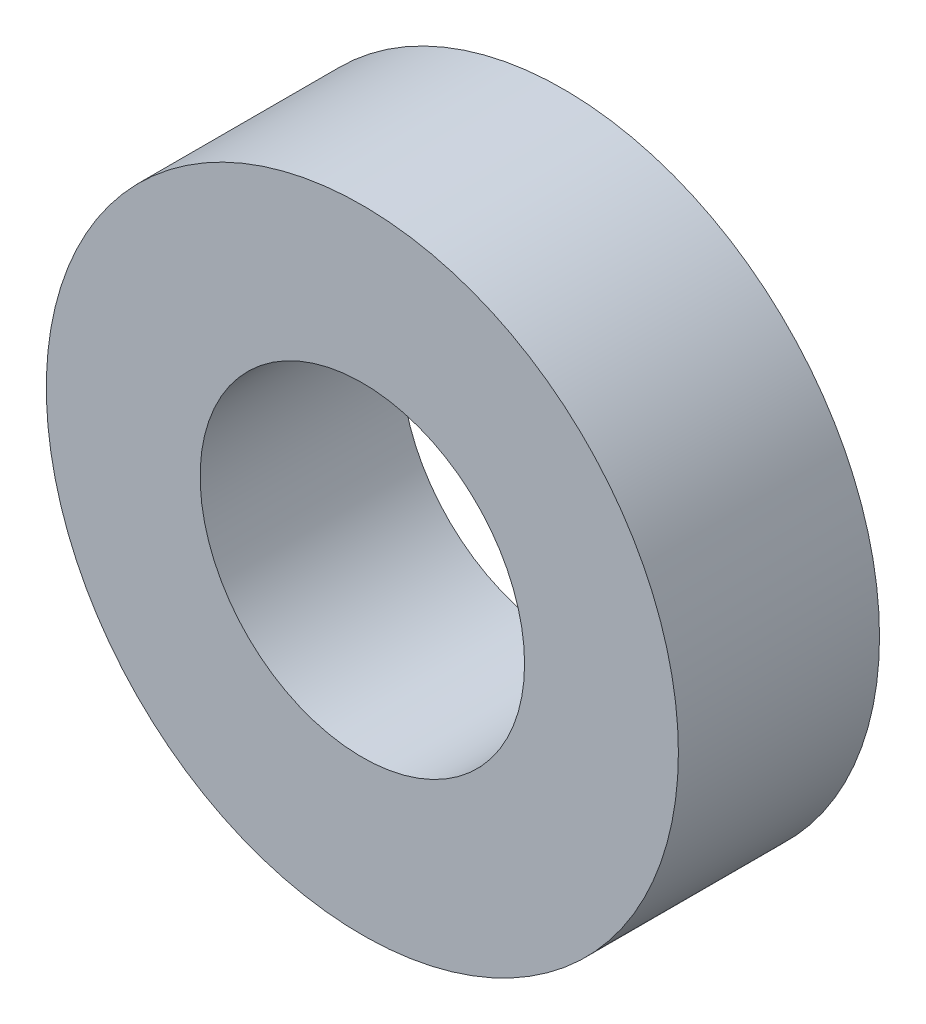
ISO-10303-21;
HEADER;
FILE_DESCRIPTION(('STEP AP214'),'2;1');
FILE_NAME('part.step','',(''),(''),'','','');
FILE_SCHEMA(('AUTOMOTIVE_DESIGN { 1 0 10303 214 1 1 1 1 }'));
ENDSEC;
DATA;
#1=APPLICATION_CONTEXT('core data for automotive mechanical design processes');
#2=APPLICATION_PROTOCOL_DEFINITION('international standard','automotive_design',2000,#1);
#3=PRODUCT_CONTEXT('',#1,'mechanical');
#4=PRODUCT('Part','Part','',(#3));
#5=PRODUCT_RELATED_PRODUCT_CATEGORY('part','',(#4));
#6=PRODUCT_DEFINITION_FORMATION('','',#4);
#7=PRODUCT_DEFINITION_CONTEXT('part definition',#1,'design');
#8=PRODUCT_DEFINITION('design','',#6,#7);
#9=PRODUCT_DEFINITION_SHAPE('','',#8);
#10=(LENGTH_UNIT() NAMED_UNIT(*) SI_UNIT(.MILLI.,.METRE.));
#11=(NAMED_UNIT(*) PLANE_ANGLE_UNIT() SI_UNIT($,.RADIAN.));
#12=(NAMED_UNIT(*) SI_UNIT($,.STERADIAN.) SOLID_ANGLE_UNIT());
#13=UNCERTAINTY_MEASURE_WITH_UNIT(LENGTH_MEASURE(1.E-05),#10,'distance_accuracy_value','');
#14=(GEOMETRIC_REPRESENTATION_CONTEXT(3) GLOBAL_UNCERTAINTY_ASSIGNED_CONTEXT((#13)) GLOBAL_UNIT_ASSIGNED_CONTEXT((#10,
#11,#12)) REPRESENTATION_CONTEXT('',''));
#15=CARTESIAN_POINT('',(0.,0.,0.));
#16=DIRECTION('',(0.,0.,1.));
#17=DIRECTION('',(1.,0.,0.));
#18=AXIS2_PLACEMENT_3D('',#15,#16,#17);
#19=CARTESIAN_POINT('',(0.,0.,7.));
#20=DIRECTION('',(0.,0.,1.));
#21=DIRECTION('',(1.,0.,0.));
#22=AXIS2_PLACEMENT_3D('',#19,#20,#21);
#23=PLANE('',#22);
#24=CARTESIAN_POINT('',(0.,0.,7.));
#25=DIRECTION('',(0.,0.,1.));
#26=DIRECTION('',(1.,0.,0.));
#27=AXIS2_PLACEMENT_3D('',#24,#25,#26);
#28=CIRCLE('',#27,11.);
#29=CARTESIAN_POINT('',(11.,0.,7.));
#30=VERTEX_POINT('',#29);
#31=EDGE_CURVE('E10',#30,#30,#28,.T.);
#32=ORIENTED_EDGE('',*,*,#31,.T.);
#33=EDGE_LOOP('',(#32));
#34=FACE_BOUND('',#33,.T.);
#35=CARTESIAN_POINT('',(0.,0.,7.));
#36=DIRECTION('',(0.,0.,1.));
#37=DIRECTION('',(1.,0.,0.));
#38=AXIS2_PLACEMENT_3D('',#35,#36,#37);
#39=CIRCLE('',#38,5.64625840261005);
#40=CARTESIAN_POINT('',(5.64625840261005,0.,7.));
#41=VERTEX_POINT('',#40);
#42=EDGE_CURVE('E42',#41,#41,#39,.T.);
#43=ORIENTED_EDGE('',*,*,#42,.F.);
#44=EDGE_LOOP('',(#43));
#45=FACE_BOUND('',#44,.T.);
#46=ADVANCED_FACE('F31',(#34,#45),#23,.T.);
#47=CARTESIAN_POINT('',(0.,0.,0.));
#48=DIRECTION('',(0.,0.,1.));
#49=DIRECTION('',(1.,0.,0.));
#50=AXIS2_PLACEMENT_3D('',#47,#48,#49);
#51=PLANE('',#50);
#52=CARTESIAN_POINT('',(0.,0.,0.));
#53=DIRECTION('',(0.,0.,1.));
#54=DIRECTION('',(1.,0.,0.));
#55=AXIS2_PLACEMENT_3D('',#52,#53,#54);
#56=CIRCLE('',#55,11.);
#57=CARTESIAN_POINT('',(11.,0.,0.));
#58=VERTEX_POINT('',#57);
#59=EDGE_CURVE('E35',#58,#58,#56,.T.);
#60=ORIENTED_EDGE('',*,*,#59,.F.);
#61=EDGE_LOOP('',(#60));
#62=FACE_BOUND('',#61,.T.);
#63=CARTESIAN_POINT('',(0.,0.,0.));
#64=DIRECTION('',(0.,0.,1.));
#65=DIRECTION('',(1.,0.,0.));
#66=AXIS2_PLACEMENT_3D('',#63,#64,#65);
#67=CIRCLE('',#66,5.64625840261005);
#68=CARTESIAN_POINT('',(5.64625840261005,0.,0.));
#69=VERTEX_POINT('',#68);
#70=EDGE_CURVE('E44',#69,#69,#67,.T.);
#71=ORIENTED_EDGE('',*,*,#70,.T.);
#72=EDGE_LOOP('',(#71));
#73=FACE_BOUND('',#72,.T.);
#74=ADVANCED_FACE('F54',(#62,#73),#51,.F.);
#75=CARTESIAN_POINT('',(0.,0.,7.));
#76=DIRECTION('',(0.,0.,-1.));
#77=DIRECTION('',(-1.,0.,0.));
#78=AXIS2_PLACEMENT_3D('',#75,#76,#77);
#79=CYLINDRICAL_SURFACE('',#78,11.);
#80=ORIENTED_EDGE('',*,*,#31,.F.);
#81=EDGE_LOOP('',(#80));
#82=FACE_BOUND('',#81,.T.);
#83=ORIENTED_EDGE('',*,*,#59,.T.);
#84=EDGE_LOOP('',(#83));
#85=FACE_BOUND('',#84,.T.);
#86=ADVANCED_FACE('F33',(#82,#85),#79,.T.);
#87=CARTESIAN_POINT('',(0.,0.,7.));
#88=DIRECTION('',(0.,0.,-1.));
#89=DIRECTION('',(-1.,0.,0.));
#90=AXIS2_PLACEMENT_3D('',#87,#88,#89);
#91=CYLINDRICAL_SURFACE('',#90,5.64625840261005);
#92=ORIENTED_EDGE('',*,*,#42,.T.);
#93=EDGE_LOOP('',(#92));
#94=FACE_BOUND('',#93,.T.);
#95=ORIENTED_EDGE('',*,*,#70,.F.);
#96=EDGE_LOOP('',(#95));
#97=FACE_BOUND('',#96,.T.);
#98=ADVANCED_FACE('F50',(#94,#97),#91,.F.);
#99=CLOSED_SHELL('',(#46,#74,#86,#98));
#100=MANIFOLD_SOLID_BREP('B2',#99);
#101=ADVANCED_BREP_SHAPE_REPRESENTATION('',(#18,#100),#14);
#102=SHAPE_DEFINITION_REPRESENTATION(#9,#101);
ENDSEC;
END-ISO-10303-21;
